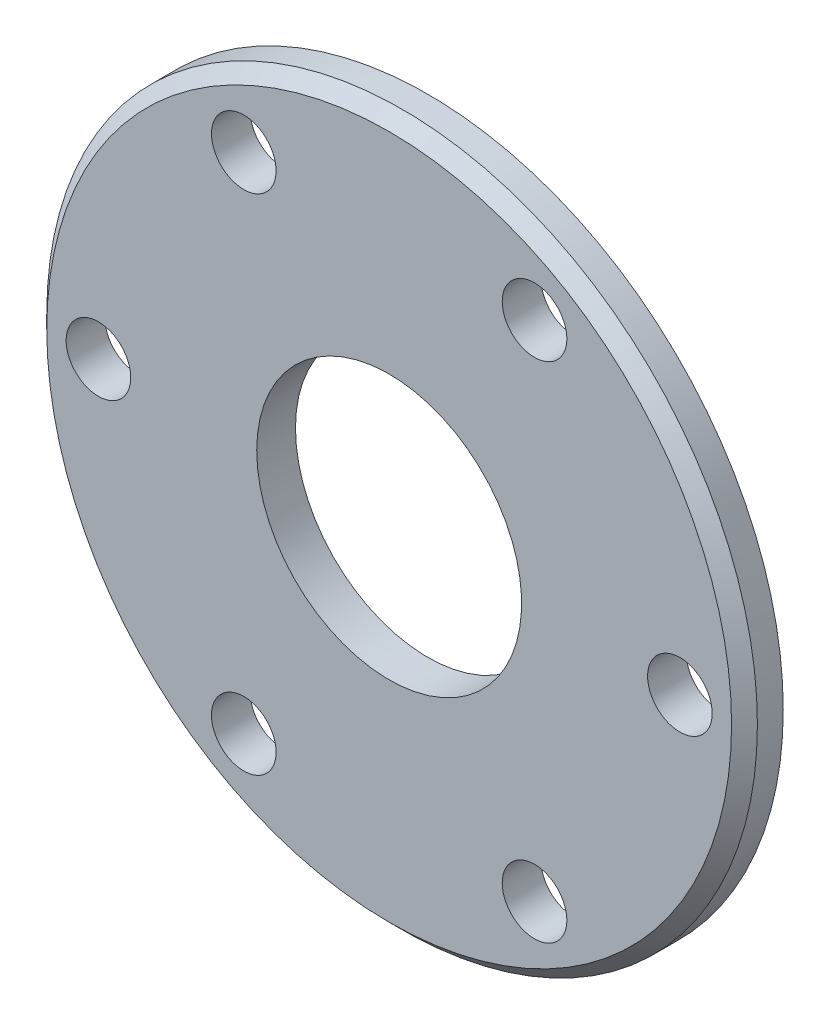
ISO-10303-21;
HEADER;
FILE_DESCRIPTION(('STEP AP214'),'2;1');
FILE_NAME('part.step','',(''),(''),'','','');
FILE_SCHEMA(('AUTOMOTIVE_DESIGN { 1 0 10303 214 1 1 1 1 }'));
ENDSEC;
DATA;
#1=APPLICATION_CONTEXT('core data for automotive mechanical design processes');
#2=APPLICATION_PROTOCOL_DEFINITION('international standard','automotive_design',2000,#1);
#3=PRODUCT_CONTEXT('',#1,'mechanical');
#4=PRODUCT('Part','Part','',(#3));
#5=PRODUCT_RELATED_PRODUCT_CATEGORY('part','',(#4));
#6=PRODUCT_DEFINITION_FORMATION('','',#4);
#7=PRODUCT_DEFINITION_CONTEXT('part definition',#1,'design');
#8=PRODUCT_DEFINITION('design','',#6,#7);
#9=PRODUCT_DEFINITION_SHAPE('','',#8);
#10=(LENGTH_UNIT() NAMED_UNIT(*) SI_UNIT(.MILLI.,.METRE.));
#11=(NAMED_UNIT(*) PLANE_ANGLE_UNIT() SI_UNIT($,.RADIAN.));
#12=(NAMED_UNIT(*) SI_UNIT($,.STERADIAN.) SOLID_ANGLE_UNIT());
#13=UNCERTAINTY_MEASURE_WITH_UNIT(LENGTH_MEASURE(1.E-05),#10,'distance_accuracy_value','');
#14=(GEOMETRIC_REPRESENTATION_CONTEXT(3) GLOBAL_UNCERTAINTY_ASSIGNED_CONTEXT((#13)) GLOBAL_UNIT_ASSIGNED_CONTEXT((#10,
#11,#12)) REPRESENTATION_CONTEXT('',''));
#15=CARTESIAN_POINT('',(0.,0.,0.));
#16=DIRECTION('',(0.,0.,1.));
#17=DIRECTION('',(1.,0.,0.));
#18=AXIS2_PLACEMENT_3D('',#15,#16,#17);
#19=CARTESIAN_POINT('',(0.,0.,3.));
#20=DIRECTION('',(0.,0.,1.));
#21=DIRECTION('',(1.,0.,0.));
#22=AXIS2_PLACEMENT_3D('',#19,#20,#21);
#23=PLANE('',#22);
#24=CARTESIAN_POINT('',(11.25,-19.48557158515,3.));
#25=DIRECTION('',(0.,0.,-1.));
#26=DIRECTION('',(-1.,0.,0.));
#27=AXIS2_PLACEMENT_3D('',#24,#25,#26);
#28=CIRCLE('',#27,2.49999999999999);
#29=CARTESIAN_POINT('',(8.75000000000001,-19.48557158515,3.));
#30=VERTEX_POINT('',#29);
#31=EDGE_CURVE('E49',#30,#30,#28,.T.);
#32=ORIENTED_EDGE('',*,*,#31,.T.);
#33=EDGE_LOOP('',(#32));
#34=FACE_BOUND('',#33,.T.);
#35=CARTESIAN_POINT('',(-11.25,-19.48557158515,3.));
#36=DIRECTION('',(0.,0.,-1.));
#37=DIRECTION('',(-1.,0.,0.));
#38=AXIS2_PLACEMENT_3D('',#35,#36,#37);
#39=CIRCLE('',#38,2.49999999999999);
#40=CARTESIAN_POINT('',(-13.75,-19.48557158515,3.));
#41=VERTEX_POINT('',#40);
#42=EDGE_CURVE('E52',#41,#41,#39,.T.);
#43=ORIENTED_EDGE('',*,*,#42,.T.);
#44=EDGE_LOOP('',(#43));
#45=FACE_BOUND('',#44,.T.);
#46=CARTESIAN_POINT('',(-22.5,0.,3.));
#47=DIRECTION('',(0.,0.,-1.));
#48=DIRECTION('',(-1.,0.,0.));
#49=AXIS2_PLACEMENT_3D('',#46,#47,#48);
#50=CIRCLE('',#49,2.49999999999999);
#51=CARTESIAN_POINT('',(-25.,0.,3.));
#52=VERTEX_POINT('',#51);
#53=EDGE_CURVE('E55',#52,#52,#50,.T.);
#54=ORIENTED_EDGE('',*,*,#53,.T.);
#55=EDGE_LOOP('',(#54));
#56=FACE_BOUND('',#55,.T.);
#57=CARTESIAN_POINT('',(-11.25,19.48557158515,3.));
#58=DIRECTION('',(0.,0.,-1.));
#59=DIRECTION('',(-1.,0.,0.));
#60=AXIS2_PLACEMENT_3D('',#57,#58,#59);
#61=CIRCLE('',#60,2.49999999999999);
#62=CARTESIAN_POINT('',(-13.75,19.48557158515,3.));
#63=VERTEX_POINT('',#62);
#64=EDGE_CURVE('E58',#63,#63,#61,.T.);
#65=ORIENTED_EDGE('',*,*,#64,.T.);
#66=EDGE_LOOP('',(#65));
#67=FACE_BOUND('',#66,.T.);
#68=CARTESIAN_POINT('',(11.25,19.48557158515,3.));
#69=DIRECTION('',(0.,0.,-1.));
#70=DIRECTION('',(-1.,0.,0.));
#71=AXIS2_PLACEMENT_3D('',#68,#69,#70);
#72=CIRCLE('',#71,2.49999999999999);
#73=CARTESIAN_POINT('',(8.75000000000001,19.48557158515,3.));
#74=VERTEX_POINT('',#73);
#75=EDGE_CURVE('E61',#74,#74,#72,.T.);
#76=ORIENTED_EDGE('',*,*,#75,.T.);
#77=EDGE_LOOP('',(#76));
#78=FACE_BOUND('',#77,.T.);
#79=CARTESIAN_POINT('',(22.5,0.,3.));
#80=DIRECTION('',(0.,0.,-1.));
#81=DIRECTION('',(-1.,0.,0.));
#82=AXIS2_PLACEMENT_3D('',#79,#80,#81);
#83=CIRCLE('',#82,2.49999999999999);
#84=CARTESIAN_POINT('',(20.,0.,3.));
#85=VERTEX_POINT('',#84);
#86=EDGE_CURVE('E64',#85,#85,#83,.T.);
#87=ORIENTED_EDGE('',*,*,#86,.T.);
#88=EDGE_LOOP('',(#87));
#89=FACE_BOUND('',#88,.T.);
#90=CARTESIAN_POINT('',(0.,0.,3.));
#91=DIRECTION('',(0.,0.,-1.));
#92=DIRECTION('',(-1.,0.,0.));
#93=AXIS2_PLACEMENT_3D('',#90,#91,#92);
#94=CIRCLE('',#93,10.25);
#95=CARTESIAN_POINT('',(-10.25,0.,3.));
#96=VERTEX_POINT('',#95);
#97=EDGE_CURVE('E66',#96,#96,#94,.T.);
#98=ORIENTED_EDGE('',*,*,#97,.T.);
#99=EDGE_LOOP('',(#98));
#100=FACE_BOUND('',#99,.T.);
#101=CARTESIAN_POINT('',(0.,0.,3.));
#102=DIRECTION('',(0.,0.,-1.));
#103=DIRECTION('',(-1.,0.,0.));
#104=AXIS2_PLACEMENT_3D('',#101,#102,#103);
#105=CIRCLE('',#104,26.499996199797);
#106=CARTESIAN_POINT('',(-26.499996199797,0.,3.));
#107=VERTEX_POINT('',#106);
#108=EDGE_CURVE('E18',#107,#107,#105,.T.);
#109=ORIENTED_EDGE('',*,*,#108,.F.);
#110=EDGE_LOOP('',(#109));
#111=FACE_BOUND('',#110,.T.);
#112=ADVANCED_FACE('F15',(#34,#45,#56,#67,#78,#89,#100,#111),#23,.T.);
#113=CARTESIAN_POINT('',(0.,0.,1.99999603496438));
#114=DIRECTION('',(0.,0.,-1.));
#115=DIRECTION('',(-1.,0.,0.));
#116=AXIS2_PLACEMENT_3D('',#113,#114,#115);
#117=CONICAL_SURFACE('',#116,27.5,0.785398080981461);
#118=ORIENTED_EDGE('',*,*,#108,.T.);
#119=EDGE_LOOP('',(#118));
#120=FACE_BOUND('',#119,.T.);
#121=CARTESIAN_POINT('',(0.,0.,1.99999603496438));
#122=DIRECTION('',(0.,0.,1.));
#123=DIRECTION('',(1.,0.,0.));
#124=AXIS2_PLACEMENT_3D('',#121,#122,#123);
#125=CIRCLE('',#124,27.5);
#126=CARTESIAN_POINT('',(27.5,0.,1.99999603496438));
#127=VERTEX_POINT('',#126);
#128=EDGE_CURVE('E30',#127,#127,#125,.F.);
#129=ORIENTED_EDGE('',*,*,#128,.F.);
#130=EDGE_LOOP('',(#129));
#131=FACE_BOUND('',#130,.T.);
#132=ADVANCED_FACE('F73',(#120,#131),#117,.T.);
#133=CARTESIAN_POINT('',(0.,0.,0.));
#134=DIRECTION('',(0.,0.,-1.));
#135=DIRECTION('',(-1.,0.,0.));
#136=AXIS2_PLACEMENT_3D('',#133,#134,#135);
#137=CYLINDRICAL_SURFACE('',#136,10.25);
#138=CARTESIAN_POINT('',(0.,0.,0.));
#139=DIRECTION('',(0.,0.,-1.));
#140=DIRECTION('',(-1.,0.,0.));
#141=AXIS2_PLACEMENT_3D('',#138,#139,#140);
#142=CIRCLE('',#141,10.25);
#143=CARTESIAN_POINT('',(-10.25,0.,0.));
#144=VERTEX_POINT('',#143);
#145=EDGE_CURVE('E46',#144,#144,#142,.F.);
#146=ORIENTED_EDGE('',*,*,#145,.F.);
#147=EDGE_LOOP('',(#146));
#148=FACE_BOUND('',#147,.T.);
#149=ORIENTED_EDGE('',*,*,#97,.F.);
#150=EDGE_LOOP('',(#149));
#151=FACE_BOUND('',#150,.T.);
#152=ADVANCED_FACE('F82',(#148,#151),#137,.F.);
#153=CARTESIAN_POINT('',(22.5,0.,0.));
#154=DIRECTION('',(0.,0.,-1.));
#155=DIRECTION('',(-1.,0.,0.));
#156=AXIS2_PLACEMENT_3D('',#153,#154,#155);
#157=CYLINDRICAL_SURFACE('',#156,2.49999999999999);
#158=CARTESIAN_POINT('',(22.5,0.,0.));
#159=DIRECTION('',(0.,0.,-1.));
#160=DIRECTION('',(-1.,0.,0.));
#161=AXIS2_PLACEMENT_3D('',#158,#159,#160);
#162=CIRCLE('',#161,2.49999999999999);
#163=CARTESIAN_POINT('',(20.,0.,0.));
#164=VERTEX_POINT('',#163);
#165=EDGE_CURVE('E43',#164,#164,#162,.F.);
#166=ORIENTED_EDGE('',*,*,#165,.F.);
#167=EDGE_LOOP('',(#166));
#168=FACE_BOUND('',#167,.T.);
#169=ORIENTED_EDGE('',*,*,#86,.F.);
#170=EDGE_LOOP('',(#169));
#171=FACE_BOUND('',#170,.T.);
#172=ADVANCED_FACE('F114',(#168,#171),#157,.F.);
#173=CARTESIAN_POINT('',(11.25,19.48557158515,0.));
#174=DIRECTION('',(0.,0.,-1.));
#175=DIRECTION('',(-1.,0.,0.));
#176=AXIS2_PLACEMENT_3D('',#173,#174,#175);
#177=CYLINDRICAL_SURFACE('',#176,2.49999999999999);
#178=CARTESIAN_POINT('',(11.25,19.48557158515,0.));
#179=DIRECTION('',(0.,0.,-1.));
#180=DIRECTION('',(-1.,0.,0.));
#181=AXIS2_PLACEMENT_3D('',#178,#179,#180);
#182=CIRCLE('',#181,2.49999999999999);
#183=CARTESIAN_POINT('',(8.75000000000001,19.48557158515,0.));
#184=VERTEX_POINT('',#183);
#185=EDGE_CURVE('E40',#184,#184,#182,.F.);
#186=ORIENTED_EDGE('',*,*,#185,.F.);
#187=EDGE_LOOP('',(#186));
#188=FACE_BOUND('',#187,.T.);
#189=ORIENTED_EDGE('',*,*,#75,.F.);
#190=EDGE_LOOP('',(#189));
#191=FACE_BOUND('',#190,.T.);
#192=ADVANCED_FACE('F110',(#188,#191),#177,.F.);
#193=CARTESIAN_POINT('',(-11.25,19.48557158515,0.));
#194=DIRECTION('',(0.,0.,-1.));
#195=DIRECTION('',(-1.,0.,0.));
#196=AXIS2_PLACEMENT_3D('',#193,#194,#195);
#197=CYLINDRICAL_SURFACE('',#196,2.49999999999999);
#198=CARTESIAN_POINT('',(-11.25,19.48557158515,0.));
#199=DIRECTION('',(0.,0.,-1.));
#200=DIRECTION('',(-1.,0.,0.));
#201=AXIS2_PLACEMENT_3D('',#198,#199,#200);
#202=CIRCLE('',#201,2.49999999999999);
#203=CARTESIAN_POINT('',(-13.75,19.48557158515,0.));
#204=VERTEX_POINT('',#203);
#205=EDGE_CURVE('E37',#204,#204,#202,.F.);
#206=ORIENTED_EDGE('',*,*,#205,.F.);
#207=EDGE_LOOP('',(#206));
#208=FACE_BOUND('',#207,.T.);
#209=ORIENTED_EDGE('',*,*,#64,.F.);
#210=EDGE_LOOP('',(#209));
#211=FACE_BOUND('',#210,.T.);
#212=ADVANCED_FACE('F106',(#208,#211),#197,.F.);
#213=CARTESIAN_POINT('',(-22.5,0.,0.));
#214=DIRECTION('',(0.,0.,-1.));
#215=DIRECTION('',(-1.,0.,0.));
#216=AXIS2_PLACEMENT_3D('',#213,#214,#215);
#217=CYLINDRICAL_SURFACE('',#216,2.49999999999999);
#218=CARTESIAN_POINT('',(-22.5,0.,0.));
#219=DIRECTION('',(0.,0.,-1.));
#220=DIRECTION('',(-1.,0.,0.));
#221=AXIS2_PLACEMENT_3D('',#218,#219,#220);
#222=CIRCLE('',#221,2.49999999999999);
#223=CARTESIAN_POINT('',(-25.,0.,0.));
#224=VERTEX_POINT('',#223);
#225=EDGE_CURVE('E34',#224,#224,#222,.F.);
#226=ORIENTED_EDGE('',*,*,#225,.F.);
#227=EDGE_LOOP('',(#226));
#228=FACE_BOUND('',#227,.T.);
#229=ORIENTED_EDGE('',*,*,#53,.F.);
#230=EDGE_LOOP('',(#229));
#231=FACE_BOUND('',#230,.T.);
#232=ADVANCED_FACE('F102',(#228,#231),#217,.F.);
#233=CARTESIAN_POINT('',(-11.25,-19.48557158515,0.));
#234=DIRECTION('',(0.,0.,-1.));
#235=DIRECTION('',(-1.,0.,0.));
#236=AXIS2_PLACEMENT_3D('',#233,#234,#235);
#237=CYLINDRICAL_SURFACE('',#236,2.49999999999999);
#238=CARTESIAN_POINT('',(-11.25,-19.48557158515,0.));
#239=DIRECTION('',(0.,0.,-1.));
#240=DIRECTION('',(-1.,0.,0.));
#241=AXIS2_PLACEMENT_3D('',#238,#239,#240);
#242=CIRCLE('',#241,2.49999999999999);
#243=CARTESIAN_POINT('',(-13.75,-19.48557158515,0.));
#244=VERTEX_POINT('',#243);
#245=EDGE_CURVE('E27',#244,#244,#242,.F.);
#246=ORIENTED_EDGE('',*,*,#245,.F.);
#247=EDGE_LOOP('',(#246));
#248=FACE_BOUND('',#247,.T.);
#249=ORIENTED_EDGE('',*,*,#42,.F.);
#250=EDGE_LOOP('',(#249));
#251=FACE_BOUND('',#250,.T.);
#252=ADVANCED_FACE('F98',(#248,#251),#237,.F.);
#253=CARTESIAN_POINT('',(11.25,-19.48557158515,0.));
#254=DIRECTION('',(0.,0.,-1.));
#255=DIRECTION('',(-1.,0.,0.));
#256=AXIS2_PLACEMENT_3D('',#253,#254,#255);
#257=CYLINDRICAL_SURFACE('',#256,2.49999999999999);
#258=CARTESIAN_POINT('',(11.25,-19.48557158515,0.));
#259=DIRECTION('',(0.,0.,-1.));
#260=DIRECTION('',(-1.,0.,0.));
#261=AXIS2_PLACEMENT_3D('',#258,#259,#260);
#262=CIRCLE('',#261,2.49999999999999);
#263=CARTESIAN_POINT('',(8.75000000000001,-19.48557158515,0.));
#264=VERTEX_POINT('',#263);
#265=EDGE_CURVE('E22',#264,#264,#262,.F.);
#266=ORIENTED_EDGE('',*,*,#265,.F.);
#267=EDGE_LOOP('',(#266));
#268=FACE_BOUND('',#267,.T.);
#269=ORIENTED_EDGE('',*,*,#31,.F.);
#270=EDGE_LOOP('',(#269));
#271=FACE_BOUND('',#270,.T.);
#272=ADVANCED_FACE('F91',(#268,#271),#257,.F.);
#273=CARTESIAN_POINT('',(0.,0.,0.));
#274=DIRECTION('',(0.,0.,1.));
#275=DIRECTION('',(1.,0.,0.));
#276=AXIS2_PLACEMENT_3D('',#273,#274,#275);
#277=CYLINDRICAL_SURFACE('',#276,27.5);
#278=CARTESIAN_POINT('',(0.,0.,0.));
#279=DIRECTION('',(0.,0.,1.));
#280=DIRECTION('',(1.,0.,0.));
#281=AXIS2_PLACEMENT_3D('',#278,#279,#280);
#282=CIRCLE('',#281,27.5);
#283=CARTESIAN_POINT('',(27.5,0.,0.));
#284=VERTEX_POINT('',#283);
#285=EDGE_CURVE('E10',#284,#284,#282,.F.);
#286=ORIENTED_EDGE('',*,*,#285,.F.);
#287=EDGE_LOOP('',(#286));
#288=FACE_BOUND('',#287,.T.);
#289=ORIENTED_EDGE('',*,*,#128,.T.);
#290=EDGE_LOOP('',(#289));
#291=FACE_BOUND('',#290,.T.);
#292=ADVANCED_FACE('F86',(#288,#291),#277,.T.);
#293=CARTESIAN_POINT('',(27.5,0.,0.));
#294=DIRECTION('',(0.,0.,-1.));
#295=DIRECTION('',(-1.,0.,0.));
#296=AXIS2_PLACEMENT_3D('',#293,#294,#295);
#297=PLANE('',#296);
#298=ORIENTED_EDGE('',*,*,#285,.T.);
#299=EDGE_LOOP('',(#298));
#300=FACE_BOUND('',#299,.T.);
#301=ORIENTED_EDGE('',*,*,#265,.T.);
#302=EDGE_LOOP('',(#301));
#303=FACE_BOUND('',#302,.T.);
#304=ORIENTED_EDGE('',*,*,#245,.T.);
#305=EDGE_LOOP('',(#304));
#306=FACE_BOUND('',#305,.T.);
#307=ORIENTED_EDGE('',*,*,#225,.T.);
#308=EDGE_LOOP('',(#307));
#309=FACE_BOUND('',#308,.T.);
#310=ORIENTED_EDGE('',*,*,#205,.T.);
#311=EDGE_LOOP('',(#310));
#312=FACE_BOUND('',#311,.T.);
#313=ORIENTED_EDGE('',*,*,#185,.T.);
#314=EDGE_LOOP('',(#313));
#315=FACE_BOUND('',#314,.T.);
#316=ORIENTED_EDGE('',*,*,#165,.T.);
#317=EDGE_LOOP('',(#316));
#318=FACE_BOUND('',#317,.T.);
#319=ORIENTED_EDGE('',*,*,#145,.T.);
#320=EDGE_LOOP('',(#319));
#321=FACE_BOUND('',#320,.T.);
#322=ADVANCED_FACE('F84',(#300,#303,#306,#309,#312,#315,#318,#321),#297,.T.);
#323=CLOSED_SHELL('',(#112,#132,#152,#172,#192,#212,#232,#252,#272,#292,#322));
#324=MANIFOLD_SOLID_BREP('B1',#323);
#325=ADVANCED_BREP_SHAPE_REPRESENTATION('',(#18,#324),#14);
#326=SHAPE_DEFINITION_REPRESENTATION(#9,#325);
ENDSEC;
END-ISO-10303-21;
